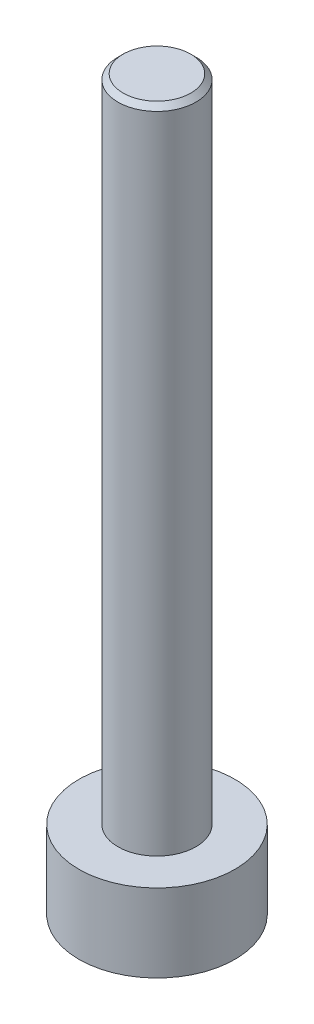
ISO-10303-21;
HEADER;
FILE_DESCRIPTION(('STEP AP214'),'2;1');
FILE_NAME('part.step','',(''),(''),'','','');
FILE_SCHEMA(('AUTOMOTIVE_DESIGN { 1 0 10303 214 1 1 1 1 }'));
ENDSEC;
DATA;
#1=APPLICATION_CONTEXT('core data for automotive mechanical design processes');
#2=APPLICATION_PROTOCOL_DEFINITION('international standard','automotive_design',2000,#1);
#3=PRODUCT_CONTEXT('',#1,'mechanical');
#4=PRODUCT('Part','Part','',(#3));
#5=PRODUCT_RELATED_PRODUCT_CATEGORY('part','',(#4));
#6=PRODUCT_DEFINITION_FORMATION('','',#4);
#7=PRODUCT_DEFINITION_CONTEXT('part definition',#1,'design');
#8=PRODUCT_DEFINITION('design','',#6,#7);
#9=PRODUCT_DEFINITION_SHAPE('','',#8);
#10=(LENGTH_UNIT() NAMED_UNIT(*) SI_UNIT(.MILLI.,.METRE.));
#11=(NAMED_UNIT(*) PLANE_ANGLE_UNIT() SI_UNIT($,.RADIAN.));
#12=(NAMED_UNIT(*) SI_UNIT($,.STERADIAN.) SOLID_ANGLE_UNIT());
#13=UNCERTAINTY_MEASURE_WITH_UNIT(LENGTH_MEASURE(1.E-05),#10,'distance_accuracy_value','');
#14=(GEOMETRIC_REPRESENTATION_CONTEXT(3) GLOBAL_UNCERTAINTY_ASSIGNED_CONTEXT((#13)) GLOBAL_UNIT_ASSIGNED_CONTEXT((#10,
#11,#12)) REPRESENTATION_CONTEXT('',''));
#15=CARTESIAN_POINT('',(0.,0.,0.));
#16=DIRECTION('',(0.,0.,1.));
#17=DIRECTION('',(1.,0.,0.));
#18=AXIS2_PLACEMENT_3D('',#15,#16,#17);
#19=CARTESIAN_POINT('',(0.,3.,0.));
#20=DIRECTION('',(0.,-1.,0.));
#21=DIRECTION('',(0.,0.,-1.));
#22=AXIS2_PLACEMENT_3D('',#19,#20,#21);
#23=CYLINDRICAL_SURFACE('',#22,3.);
#24=CARTESIAN_POINT('',(0.,3.,0.));
#25=DIRECTION('',(0.,1.,0.));
#26=DIRECTION('',(0.,0.,1.));
#27=AXIS2_PLACEMENT_3D('',#24,#25,#26);
#28=CIRCLE('',#27,3.);
#29=CARTESIAN_POINT('',(0.,3.,3.));
#30=VERTEX_POINT('',#29);
#31=EDGE_CURVE('E159',#30,#30,#28,.T.);
#32=ORIENTED_EDGE('',*,*,#31,.F.);
#33=EDGE_LOOP('',(#32));
#34=FACE_BOUND('',#33,.T.);
#35=CARTESIAN_POINT('',(0.,0.,0.));
#36=DIRECTION('',(0.,1.,0.));
#37=DIRECTION('',(0.,0.,1.));
#38=AXIS2_PLACEMENT_3D('',#35,#36,#37);
#39=CIRCLE('',#38,3.);
#40=CARTESIAN_POINT('',(0.,0.,3.));
#41=VERTEX_POINT('',#40);
#42=EDGE_CURVE('E150',#41,#41,#39,.T.);
#43=ORIENTED_EDGE('',*,*,#42,.T.);
#44=EDGE_LOOP('',(#43));
#45=FACE_BOUND('',#44,.T.);
#46=ADVANCED_FACE('F47',(#34,#45),#23,.T.);
#47=CARTESIAN_POINT('',(0.,3.,0.));
#48=DIRECTION('',(0.,1.,0.));
#49=DIRECTION('',(0.,0.,1.));
#50=AXIS2_PLACEMENT_3D('',#47,#48,#49);
#51=PLANE('',#50);
#52=CARTESIAN_POINT('',(0.,3.,0.));
#53=DIRECTION('',(0.,1.,0.));
#54=DIRECTION('',(0.,0.,1.));
#55=AXIS2_PLACEMENT_3D('',#52,#53,#54);
#56=CIRCLE('',#55,1.5);
#57=CARTESIAN_POINT('',(0.,3.,1.5));
#58=VERTEX_POINT('',#57);
#59=EDGE_CURVE('E156',#58,#58,#56,.T.);
#60=ORIENTED_EDGE('',*,*,#59,.F.);
#61=EDGE_LOOP('',(#60));
#62=FACE_BOUND('',#61,.T.);
#63=ORIENTED_EDGE('',*,*,#31,.T.);
#64=EDGE_LOOP('',(#63));
#65=FACE_BOUND('',#64,.T.);
#66=ADVANCED_FACE('F182',(#62,#65),#51,.T.);
#67=CARTESIAN_POINT('',(0.,0.,0.));
#68=DIRECTION('',(0.,1.,0.));
#69=DIRECTION('',(0.,0.,1.));
#70=AXIS2_PLACEMENT_3D('',#67,#68,#69);
#71=PLANE('',#70);
#72=DIRECTION('',(-0.866025403784438,0.,-0.500000000000001));
#73=VECTOR('',#72,1.);
#74=CARTESIAN_POINT('',(0.,0.,1.52910369430466));
#75=LINE('',#74,#73);
#76=CARTESIAN_POINT('',(0.,0.,1.52910369430466));
#77=VERTEX_POINT('',#76);
#78=CARTESIAN_POINT('',(-1.32424264428847,0.,0.764551847152328));
#79=VERTEX_POINT('',#78);
#80=EDGE_CURVE('E137',#77,#79,#75,.T.);
#81=ORIENTED_EDGE('',*,*,#80,.F.);
#82=DIRECTION('',(-0.866025403784441,0.,0.499999999999995));
#83=VECTOR('',#82,1.);
#84=CARTESIAN_POINT('',(1.32424264428846,0.,0.764551847152347));
#85=LINE('',#84,#83);
#86=CARTESIAN_POINT('',(1.32424264428846,0.,0.764551847152347));
#87=VERTEX_POINT('',#86);
#88=EDGE_CURVE('E63',#87,#77,#85,.T.);
#89=ORIENTED_EDGE('',*,*,#88,.F.);
#90=DIRECTION('',(0.,0.,1.));
#91=VECTOR('',#90,1.);
#92=CARTESIAN_POINT('',(1.32424264428848,0.,-0.764551847152319));
#93=LINE('',#92,#91);
#94=CARTESIAN_POINT('',(1.32424264428848,0.,-0.764551847152319));
#95=VERTEX_POINT('',#94);
#96=EDGE_CURVE('E146',#95,#87,#93,.T.);
#97=ORIENTED_EDGE('',*,*,#96,.F.);
#98=DIRECTION('',(0.866025403784435,0.,0.500000000000007));
#99=VECTOR('',#98,1.);
#100=CARTESIAN_POINT('',(0.,0.,-1.52910369430466));
#101=LINE('',#100,#99);
#102=CARTESIAN_POINT('',(0.,0.,-1.52910369430466));
#103=VERTEX_POINT('',#102);
#104=EDGE_CURVE('E144',#103,#95,#101,.T.);
#105=ORIENTED_EDGE('',*,*,#104,.F.);
#106=DIRECTION('',(0.866025403784442,0.,-0.499999999999995));
#107=VECTOR('',#106,1.);
#108=CARTESIAN_POINT('',(-1.32424264428847,0.,-0.764551847152337));
#109=LINE('',#108,#107);
#110=CARTESIAN_POINT('',(-1.32424264428847,0.,-0.764551847152337));
#111=VERTEX_POINT('',#110);
#112=EDGE_CURVE('E111',#111,#103,#109,.T.);
#113=ORIENTED_EDGE('',*,*,#112,.F.);
#114=DIRECTION('',(0.,0.,-1.));
#115=VECTOR('',#114,1.);
#116=CARTESIAN_POINT('',(-1.32424264428847,0.,0.764551847152328));
#117=LINE('',#116,#115);
#118=EDGE_CURVE('E140',#79,#111,#117,.T.);
#119=ORIENTED_EDGE('',*,*,#118,.F.);
#120=EDGE_LOOP('',(#81,#89,#97,#105,#113,#119));
#121=FACE_BOUND('',#120,.T.);
#122=ORIENTED_EDGE('',*,*,#42,.F.);
#123=EDGE_LOOP('',(#122));
#124=FACE_BOUND('',#123,.T.);
#125=ADVANCED_FACE('F187',(#121,#124),#71,.F.);
#126=CARTESIAN_POINT('',(0.,28.,0.));
#127=DIRECTION('',(0.,-1.,0.));
#128=DIRECTION('',(0.,0.,-1.));
#129=AXIS2_PLACEMENT_3D('',#126,#127,#128);
#130=CYLINDRICAL_SURFACE('',#129,1.5);
#131=CARTESIAN_POINT('',(0.,27.8,0.));
#132=DIRECTION('',(0.,1.,0.));
#133=DIRECTION('',(0.,0.,1.));
#134=AXIS2_PLACEMENT_3D('',#131,#132,#133);
#135=CIRCLE('',#134,1.5);
#136=CARTESIAN_POINT('',(0.,27.8,1.5));
#137=VERTEX_POINT('',#136);
#138=EDGE_CURVE('E11',#137,#137,#135,.F.);
#139=ORIENTED_EDGE('',*,*,#138,.T.);
#140=EDGE_LOOP('',(#139));
#141=FACE_BOUND('',#140,.T.);
#142=ORIENTED_EDGE('',*,*,#59,.T.);
#143=EDGE_LOOP('',(#142));
#144=FACE_BOUND('',#143,.T.);
#145=ADVANCED_FACE('F178',(#141,#144),#130,.T.);
#146=CARTESIAN_POINT('',(0.,28.,0.));
#147=DIRECTION('',(0.,1.,0.));
#148=DIRECTION('',(0.,0.,1.));
#149=AXIS2_PLACEMENT_3D('',#146,#147,#148);
#150=PLANE('',#149);
#151=CARTESIAN_POINT('',(0.,28.,0.));
#152=DIRECTION('',(0.,1.,0.));
#153=DIRECTION('',(0.,0.,1.));
#154=AXIS2_PLACEMENT_3D('',#151,#152,#153);
#155=CIRCLE('',#154,1.30000000000001);
#156=CARTESIAN_POINT('',(0.,28.,1.30000000000001));
#157=VERTEX_POINT('',#156);
#158=EDGE_CURVE('E56',#157,#157,#155,.T.);
#159=ORIENTED_EDGE('',*,*,#158,.T.);
#160=EDGE_LOOP('',(#159));
#161=FACE_BOUND('',#160,.T.);
#162=ADVANCED_FACE('F166',(#161),#150,.T.);
#163=CARTESIAN_POINT('',(0.,28.,0.));
#164=DIRECTION('',(0.,-1.,0.));
#165=DIRECTION('',(0.,0.,-1.));
#166=AXIS2_PLACEMENT_3D('',#163,#164,#165);
#167=CONICAL_SURFACE('',#166,1.30000000000001,0.785398163397446);
#168=ORIENTED_EDGE('',*,*,#138,.F.);
#169=EDGE_LOOP('',(#168));
#170=FACE_BOUND('',#169,.T.);
#171=ORIENTED_EDGE('',*,*,#158,.F.);
#172=EDGE_LOOP('',(#171));
#173=FACE_BOUND('',#172,.T.);
#174=ADVANCED_FACE('F50',(#170,#173),#167,.T.);
#175=CARTESIAN_POINT('',(1.32424264428846,2.,0.764551847152347));
#176=DIRECTION('',(0.499999999999995,0.,0.866025403784441));
#177=DIRECTION('',(0.866025403784442,0.,-0.499999999999995));
#178=AXIS2_PLACEMENT_3D('',#175,#176,#177);
#179=PLANE('',#178);
#180=ORIENTED_EDGE('',*,*,#88,.T.);
#181=DIRECTION('',(0.,-1.,0.));
#182=VECTOR('',#181,1.);
#183=CARTESIAN_POINT('',(0.,2.,1.52910369430466));
#184=LINE('',#183,#182);
#185=CARTESIAN_POINT('',(0.,2.,1.52910369430466));
#186=VERTEX_POINT('',#185);
#187=EDGE_CURVE('E93',#186,#77,#184,.T.);
#188=ORIENTED_EDGE('',*,*,#187,.F.);
#189=DIRECTION('',(-0.866025403784441,0.,0.499999999999995));
#190=VECTOR('',#189,1.);
#191=CARTESIAN_POINT('',(1.32424264428846,2.,0.764551847152347));
#192=LINE('',#191,#190);
#193=CARTESIAN_POINT('',(1.32424264428846,2.,0.764551847152347));
#194=VERTEX_POINT('',#193);
#195=EDGE_CURVE('E148',#194,#186,#192,.T.);
#196=ORIENTED_EDGE('',*,*,#195,.F.);
#197=DIRECTION('',(0.,-1.,0.));
#198=VECTOR('',#197,1.);
#199=CARTESIAN_POINT('',(1.32424264428846,2.,0.764551847152347));
#200=LINE('',#199,#198);
#201=EDGE_CURVE('E71',#194,#87,#200,.T.);
#202=ORIENTED_EDGE('',*,*,#201,.T.);
#203=EDGE_LOOP('',(#180,#188,#196,#202));
#204=FACE_BOUND('',#203,.T.);
#205=ADVANCED_FACE('F169',(#204),#179,.F.);
#206=CARTESIAN_POINT('',(1.32424264428848,2.,-0.764551847152319));
#207=DIRECTION('',(1.,0.,0.));
#208=DIRECTION('',(0.,0.,-1.));
#209=AXIS2_PLACEMENT_3D('',#206,#207,#208);
#210=PLANE('',#209);
#211=ORIENTED_EDGE('',*,*,#96,.T.);
#212=ORIENTED_EDGE('',*,*,#201,.F.);
#213=DIRECTION('',(0.,0.,1.));
#214=VECTOR('',#213,1.);
#215=CARTESIAN_POINT('',(1.32424264428848,2.,-0.764551847152319));
#216=LINE('',#215,#214);
#217=CARTESIAN_POINT('',(1.32424264428848,2.,-0.764551847152319));
#218=VERTEX_POINT('',#217);
#219=EDGE_CURVE('E123',#218,#194,#216,.T.);
#220=ORIENTED_EDGE('',*,*,#219,.F.);
#221=DIRECTION('',(0.,-1.,0.));
#222=VECTOR('',#221,1.);
#223=CARTESIAN_POINT('',(1.32424264428848,2.,-0.764551847152319));
#224=LINE('',#223,#222);
#225=EDGE_CURVE('E115',#218,#95,#224,.T.);
#226=ORIENTED_EDGE('',*,*,#225,.T.);
#227=EDGE_LOOP('',(#211,#212,#220,#226));
#228=FACE_BOUND('',#227,.T.);
#229=ADVANCED_FACE('F176',(#228),#210,.F.);
#230=CARTESIAN_POINT('',(0.,2.,-1.52910369430466));
#231=DIRECTION('',(0.500000000000007,0.,-0.866025403784435));
#232=DIRECTION('',(-0.866025403784435,0.,-0.500000000000007));
#233=AXIS2_PLACEMENT_3D('',#230,#231,#232);
#234=PLANE('',#233);
#235=ORIENTED_EDGE('',*,*,#104,.T.);
#236=ORIENTED_EDGE('',*,*,#225,.F.);
#237=DIRECTION('',(0.866025403784435,0.,0.500000000000007));
#238=VECTOR('',#237,1.);
#239=CARTESIAN_POINT('',(0.,2.,-1.52910369430466));
#240=LINE('',#239,#238);
#241=CARTESIAN_POINT('',(0.,2.,-1.52910369430466));
#242=VERTEX_POINT('',#241);
#243=EDGE_CURVE('E119',#242,#218,#240,.T.);
#244=ORIENTED_EDGE('',*,*,#243,.F.);
#245=DIRECTION('',(0.,-1.,0.));
#246=VECTOR('',#245,1.);
#247=CARTESIAN_POINT('',(0.,2.,-1.52910369430466));
#248=LINE('',#247,#246);
#249=EDGE_CURVE('E104',#242,#103,#248,.T.);
#250=ORIENTED_EDGE('',*,*,#249,.T.);
#251=EDGE_LOOP('',(#235,#236,#244,#250));
#252=FACE_BOUND('',#251,.T.);
#253=ADVANCED_FACE('F120',(#252),#234,.F.);
#254=CARTESIAN_POINT('',(-1.32424264428847,2.,-0.764551847152337));
#255=DIRECTION('',(-0.499999999999995,0.,-0.866025403784442));
#256=DIRECTION('',(-0.866025403784442,0.,0.499999999999995));
#257=AXIS2_PLACEMENT_3D('',#254,#255,#256);
#258=PLANE('',#257);
#259=ORIENTED_EDGE('',*,*,#112,.T.);
#260=ORIENTED_EDGE('',*,*,#249,.F.);
#261=DIRECTION('',(0.866025403784442,0.,-0.499999999999995));
#262=VECTOR('',#261,1.);
#263=CARTESIAN_POINT('',(-1.32424264428847,2.,-0.764551847152337));
#264=LINE('',#263,#262);
#265=CARTESIAN_POINT('',(-1.32424264428847,2.,-0.764551847152337));
#266=VERTEX_POINT('',#265);
#267=EDGE_CURVE('E108',#266,#242,#264,.T.);
#268=ORIENTED_EDGE('',*,*,#267,.F.);
#269=DIRECTION('',(0.,-1.,0.));
#270=VECTOR('',#269,1.);
#271=CARTESIAN_POINT('',(-1.32424264428847,2.,-0.764551847152337));
#272=LINE('',#271,#270);
#273=EDGE_CURVE('E116',#266,#111,#272,.T.);
#274=ORIENTED_EDGE('',*,*,#273,.T.);
#275=EDGE_LOOP('',(#259,#260,#268,#274));
#276=FACE_BOUND('',#275,.T.);
#277=ADVANCED_FACE('F106',(#276),#258,.F.);
#278=CARTESIAN_POINT('',(-1.32424264428847,2.,0.764551847152328));
#279=DIRECTION('',(-1.,0.,0.));
#280=DIRECTION('',(0.,0.,1.));
#281=AXIS2_PLACEMENT_3D('',#278,#279,#280);
#282=PLANE('',#281);
#283=ORIENTED_EDGE('',*,*,#118,.T.);
#284=ORIENTED_EDGE('',*,*,#273,.F.);
#285=DIRECTION('',(0.,0.,-1.));
#286=VECTOR('',#285,1.);
#287=CARTESIAN_POINT('',(-1.32424264428847,2.,0.764551847152328));
#288=LINE('',#287,#286);
#289=CARTESIAN_POINT('',(-1.32424264428847,2.,0.764551847152328));
#290=VERTEX_POINT('',#289);
#291=EDGE_CURVE('E129',#290,#266,#288,.T.);
#292=ORIENTED_EDGE('',*,*,#291,.F.);
#293=DIRECTION('',(0.,-1.,0.));
#294=VECTOR('',#293,1.);
#295=CARTESIAN_POINT('',(-1.32424264428847,2.,0.764551847152328));
#296=LINE('',#295,#294);
#297=EDGE_CURVE('E153',#290,#79,#296,.T.);
#298=ORIENTED_EDGE('',*,*,#297,.T.);
#299=EDGE_LOOP('',(#283,#284,#292,#298));
#300=FACE_BOUND('',#299,.T.);
#301=ADVANCED_FACE('F201',(#300),#282,.F.);
#302=CARTESIAN_POINT('',(0.,2.,1.52910369430466));
#303=DIRECTION('',(-0.500000000000001,0.,0.866025403784438));
#304=DIRECTION('',(0.866025403784438,0.,0.500000000000001));
#305=AXIS2_PLACEMENT_3D('',#302,#303,#304);
#306=PLANE('',#305);
#307=ORIENTED_EDGE('',*,*,#80,.T.);
#308=ORIENTED_EDGE('',*,*,#297,.F.);
#309=DIRECTION('',(-0.866025403784438,0.,-0.500000000000001));
#310=VECTOR('',#309,1.);
#311=CARTESIAN_POINT('',(0.,2.,1.52910369430466));
#312=LINE('',#311,#310);
#313=EDGE_CURVE('E131',#186,#290,#312,.T.);
#314=ORIENTED_EDGE('',*,*,#313,.F.);
#315=ORIENTED_EDGE('',*,*,#187,.T.);
#316=EDGE_LOOP('',(#307,#308,#314,#315));
#317=FACE_BOUND('',#316,.T.);
#318=ADVANCED_FACE('F198',(#317),#306,.F.);
#319=CARTESIAN_POINT('',(0.,2.,0.));
#320=DIRECTION('',(0.,-1.,0.));
#321=DIRECTION('',(0.,0.,-1.));
#322=AXIS2_PLACEMENT_3D('',#319,#320,#321);
#323=PLANE('',#322);
#324=ORIENTED_EDGE('',*,*,#195,.T.);
#325=ORIENTED_EDGE('',*,*,#313,.T.);
#326=ORIENTED_EDGE('',*,*,#291,.T.);
#327=ORIENTED_EDGE('',*,*,#267,.T.);
#328=ORIENTED_EDGE('',*,*,#243,.T.);
#329=ORIENTED_EDGE('',*,*,#219,.T.);
#330=EDGE_LOOP('',(#324,#325,#326,#327,#328,#329));
#331=FACE_BOUND('',#330,.T.);
#332=ADVANCED_FACE('F126',(#331),#323,.T.);
#333=CLOSED_SHELL('',(#46,#66,#125,#145,#162,#174,#205,#229,#253,#277,#301,#318,#332));
#334=MANIFOLD_SOLID_BREP('B2',#333);
#335=ADVANCED_BREP_SHAPE_REPRESENTATION('',(#18,#334),#14);
#336=SHAPE_DEFINITION_REPRESENTATION(#9,#335);
ENDSEC;
END-ISO-10303-21;
